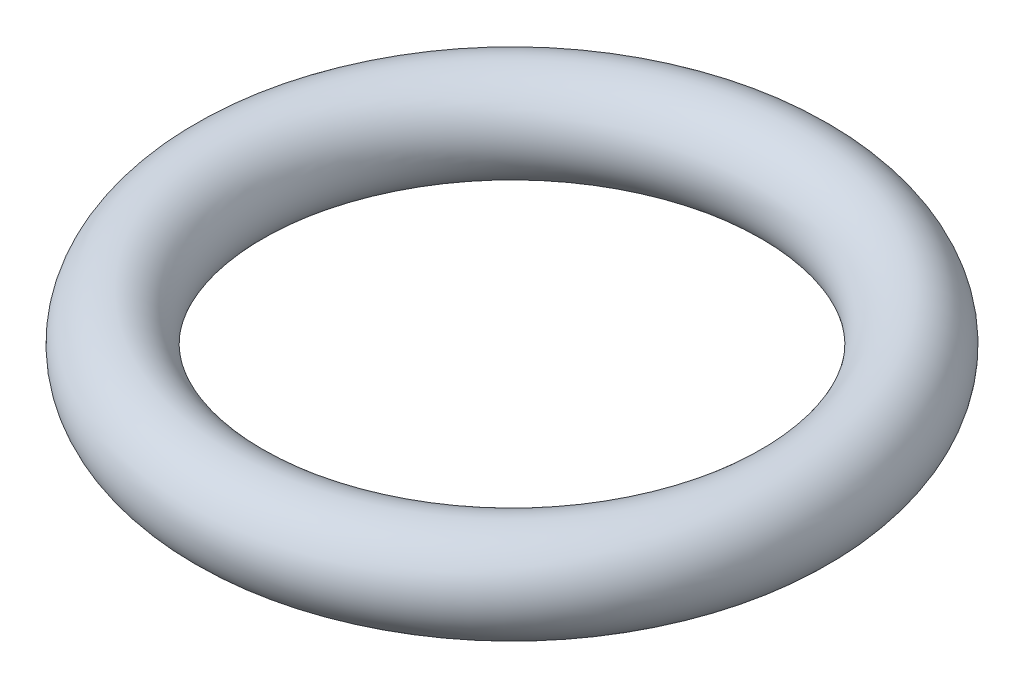
ISO-10303-21;
HEADER;
FILE_DESCRIPTION(('STEP AP214'),'2;1');
FILE_NAME('part.step','',(''),(''),'','','');
FILE_SCHEMA(('AUTOMOTIVE_DESIGN { 1 0 10303 214 1 1 1 1 }'));
ENDSEC;
DATA;
#1=APPLICATION_CONTEXT('core data for automotive mechanical design processes');
#2=APPLICATION_PROTOCOL_DEFINITION('international standard','automotive_design',2000,#1);
#3=PRODUCT_CONTEXT('',#1,'mechanical');
#4=PRODUCT('Part','Part','',(#3));
#5=PRODUCT_RELATED_PRODUCT_CATEGORY('part','',(#4));
#6=PRODUCT_DEFINITION_FORMATION('','',#4);
#7=PRODUCT_DEFINITION_CONTEXT('part definition',#1,'design');
#8=PRODUCT_DEFINITION('design','',#6,#7);
#9=PRODUCT_DEFINITION_SHAPE('','',#8);
#10=(LENGTH_UNIT() NAMED_UNIT(*) SI_UNIT(.MILLI.,.METRE.));
#11=(NAMED_UNIT(*) PLANE_ANGLE_UNIT() SI_UNIT($,.RADIAN.));
#12=(NAMED_UNIT(*) SI_UNIT($,.STERADIAN.) SOLID_ANGLE_UNIT());
#13=UNCERTAINTY_MEASURE_WITH_UNIT(LENGTH_MEASURE(1.E-05),#10,'distance_accuracy_value','');
#14=(GEOMETRIC_REPRESENTATION_CONTEXT(3) GLOBAL_UNCERTAINTY_ASSIGNED_CONTEXT((#13)) GLOBAL_UNIT_ASSIGNED_CONTEXT((#10,
#11,#12)) REPRESENTATION_CONTEXT('',''));
#15=CARTESIAN_POINT('',(0.,0.,0.));
#16=DIRECTION('',(0.,0.,1.));
#17=DIRECTION('',(1.,0.,0.));
#18=AXIS2_PLACEMENT_3D('',#15,#16,#17);
#19=CARTESIAN_POINT('',(0.,0.,0.));
#20=DIRECTION('',(0.,-1.,0.));
#21=DIRECTION('',(0.,0.,-1.));
#22=AXIS2_PLACEMENT_3D('',#19,#20,#21);
#23=TOROIDAL_SURFACE('',#22,19.05,3.175);
#24=CARTESIAN_POINT('',(0.,0.,-22.225));
#25=VERTEX_POINT('',#24);
#26=VERTEX_LOOP('',#25);
#27=FACE_BOUND('',#26,.T.);
#28=ADVANCED_FACE('F29',(#27),#23,.T.);
#29=CLOSED_SHELL('',(#28));
#30=MANIFOLD_SOLID_BREP('B2',#29);
#31=ADVANCED_BREP_SHAPE_REPRESENTATION('',(#18,#30),#14);
#32=SHAPE_DEFINITION_REPRESENTATION(#9,#31);
ENDSEC;
END-ISO-10303-21;
